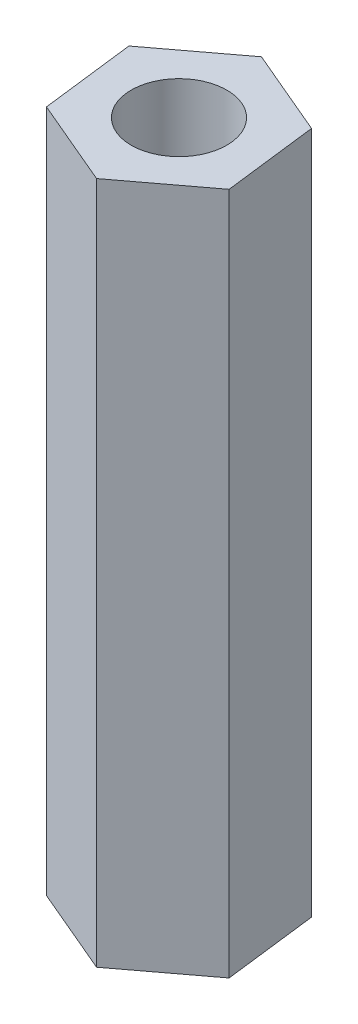
ISO-10303-21;
HEADER;
FILE_DESCRIPTION(('STEP AP214'),'2;1');
FILE_NAME('part.step','',(''),(''),'','','');
FILE_SCHEMA(('AUTOMOTIVE_DESIGN { 1 0 10303 214 1 1 1 1 }'));
ENDSEC;
DATA;
#1=APPLICATION_CONTEXT('core data for automotive mechanical design processes');
#2=APPLICATION_PROTOCOL_DEFINITION('international standard','automotive_design',2000,#1);
#3=PRODUCT_CONTEXT('',#1,'mechanical');
#4=PRODUCT('Part','Part','',(#3));
#5=PRODUCT_RELATED_PRODUCT_CATEGORY('part','',(#4));
#6=PRODUCT_DEFINITION_FORMATION('','',#4);
#7=PRODUCT_DEFINITION_CONTEXT('part definition',#1,'design');
#8=PRODUCT_DEFINITION('design','',#6,#7);
#9=PRODUCT_DEFINITION_SHAPE('','',#8);
#10=(LENGTH_UNIT() NAMED_UNIT(*) SI_UNIT(.MILLI.,.METRE.));
#11=(NAMED_UNIT(*) PLANE_ANGLE_UNIT() SI_UNIT($,.RADIAN.));
#12=(NAMED_UNIT(*) SI_UNIT($,.STERADIAN.) SOLID_ANGLE_UNIT());
#13=UNCERTAINTY_MEASURE_WITH_UNIT(LENGTH_MEASURE(1.E-05),#10,'distance_accuracy_value','');
#14=(GEOMETRIC_REPRESENTATION_CONTEXT(3) GLOBAL_UNCERTAINTY_ASSIGNED_CONTEXT((#13)) GLOBAL_UNIT_ASSIGNED_CONTEXT((#10,
#11,#12)) REPRESENTATION_CONTEXT('',''));
#15=CARTESIAN_POINT('',(0.,0.,0.));
#16=DIRECTION('',(0.,0.,1.));
#17=DIRECTION('',(1.,0.,0.));
#18=AXIS2_PLACEMENT_3D('',#15,#16,#17);
#19=CARTESIAN_POINT('',(0.,30.,0.));
#20=DIRECTION('',(0.,1.,0.));
#21=DIRECTION('',(0.,0.,1.));
#22=AXIS2_PLACEMENT_3D('',#19,#20,#21);
#23=PLANE('',#22);
#24=DIRECTION('',(-0.121573231281393,0.,-0.992582464803706));
#25=VECTOR('',#24,1.);
#26=CARTESIAN_POINT('',(3.82598208939698,30.,1.62538027907734));
#27=LINE('',#26,#25);
#28=CARTESIAN_POINT('',(3.82598208939698,30.,1.62538027907734));
#29=VERTEX_POINT('',#28);
#30=CARTESIAN_POINT('',(3.32061165718971,30.,-2.50070754430338));
#31=VERTEX_POINT('',#30);
#32=EDGE_CURVE('E131',#29,#31,#27,.T.);
#33=ORIENTED_EDGE('',*,*,#32,.T.);
#34=DIRECTION('',(-0.92038824551168,0.,-0.391005725692006));
#35=VECTOR('',#34,1.);
#36=CARTESIAN_POINT('',(3.32061165718971,30.,-2.50070754430338));
#37=LINE('',#36,#35);
#38=CARTESIAN_POINT('',(-0.505370432207269,30.,-4.12608782338072));
#39=VERTEX_POINT('',#38);
#40=EDGE_CURVE('E89',#31,#39,#37,.T.);
#41=ORIENTED_EDGE('',*,*,#40,.T.);
#42=DIRECTION('',(-0.798815014230286,0.,0.601576739111701));
#43=VECTOR('',#42,1.);
#44=CARTESIAN_POINT('',(-0.505370432207269,30.,-4.12608782338072));
#45=LINE('',#44,#43);
#46=CARTESIAN_POINT('',(-3.82598208939698,30.,-1.62538027907734));
#47=VERTEX_POINT('',#46);
#48=EDGE_CURVE('E102',#39,#47,#45,.T.);
#49=ORIENTED_EDGE('',*,*,#48,.T.);
#50=DIRECTION('',(0.121573231281393,0.,0.992582464803706));
#51=VECTOR('',#50,1.);
#52=CARTESIAN_POINT('',(-3.82598208939698,30.,-1.62538027907734));
#53=LINE('',#52,#51);
#54=CARTESIAN_POINT('',(-3.32061165718971,30.,2.50070754430338));
#55=VERTEX_POINT('',#54);
#56=EDGE_CURVE('E96',#47,#55,#53,.T.);
#57=ORIENTED_EDGE('',*,*,#56,.T.);
#58=DIRECTION('',(0.92038824551168,0.,0.391005725692006));
#59=VECTOR('',#58,1.);
#60=CARTESIAN_POINT('',(-3.32061165718971,30.,2.50070754430338));
#61=LINE('',#60,#59);
#62=CARTESIAN_POINT('',(0.50537043220727,30.,4.12608782338072));
#63=VERTEX_POINT('',#62);
#64=EDGE_CURVE('E100',#55,#63,#61,.T.);
#65=ORIENTED_EDGE('',*,*,#64,.T.);
#66=DIRECTION('',(0.798815014230286,0.,-0.601576739111701));
#67=VECTOR('',#66,1.);
#68=CARTESIAN_POINT('',(0.50537043220727,30.,4.12608782338072));
#69=LINE('',#68,#67);
#70=EDGE_CURVE('E52',#63,#29,#69,.T.);
#71=ORIENTED_EDGE('',*,*,#70,.T.);
#72=EDGE_LOOP('',(#33,#41,#49,#57,#65,#71));
#73=FACE_BOUND('',#72,.T.);
#74=CARTESIAN_POINT('',(0.,30.,0.));
#75=DIRECTION('',(0.,1.,0.));
#76=DIRECTION('',(0.,0.,1.));
#77=AXIS2_PLACEMENT_3D('',#74,#75,#76);
#78=CIRCLE('',#77,2.1);
#79=CARTESIAN_POINT('',(0.,30.,2.1));
#80=VERTEX_POINT('',#79);
#81=EDGE_CURVE('E124',#80,#80,#78,.T.);
#82=ORIENTED_EDGE('',*,*,#81,.F.);
#83=EDGE_LOOP('',(#82));
#84=FACE_BOUND('',#83,.T.);
#85=ADVANCED_FACE('F35',(#73,#84),#23,.T.);
#86=CARTESIAN_POINT('',(0.,0.,0.));
#87=DIRECTION('',(0.,1.,0.));
#88=DIRECTION('',(0.,0.,1.));
#89=AXIS2_PLACEMENT_3D('',#86,#87,#88);
#90=PLANE('',#89);
#91=DIRECTION('',(-0.121573231281393,0.,-0.992582464803706));
#92=VECTOR('',#91,1.);
#93=CARTESIAN_POINT('',(3.82598208939698,0.,1.62538027907734));
#94=LINE('',#93,#92);
#95=CARTESIAN_POINT('',(3.82598208939698,0.,1.62538027907734));
#96=VERTEX_POINT('',#95);
#97=CARTESIAN_POINT('',(3.32061165718971,0.,-2.50070754430338));
#98=VERTEX_POINT('',#97);
#99=EDGE_CURVE('E120',#96,#98,#94,.T.);
#100=ORIENTED_EDGE('',*,*,#99,.F.);
#101=DIRECTION('',(0.798815014230286,0.,-0.601576739111701));
#102=VECTOR('',#101,1.);
#103=CARTESIAN_POINT('',(0.50537043220727,0.,4.12608782338072));
#104=LINE('',#103,#102);
#105=CARTESIAN_POINT('',(0.50537043220727,0.,4.12608782338072));
#106=VERTEX_POINT('',#105);
#107=EDGE_CURVE('E81',#106,#96,#104,.T.);
#108=ORIENTED_EDGE('',*,*,#107,.F.);
#109=DIRECTION('',(0.92038824551168,0.,0.391005725692006));
#110=VECTOR('',#109,1.);
#111=CARTESIAN_POINT('',(-3.32061165718971,0.,2.50070754430338));
#112=LINE('',#111,#110);
#113=CARTESIAN_POINT('',(-3.32061165718971,0.,2.50070754430338));
#114=VERTEX_POINT('',#113);
#115=EDGE_CURVE('E75',#114,#106,#112,.T.);
#116=ORIENTED_EDGE('',*,*,#115,.F.);
#117=DIRECTION('',(0.121573231281393,0.,0.992582464803706));
#118=VECTOR('',#117,1.);
#119=CARTESIAN_POINT('',(-3.82598208939698,0.,-1.62538027907734));
#120=LINE('',#119,#118);
#121=CARTESIAN_POINT('',(-3.82598208939698,0.,-1.62538027907734));
#122=VERTEX_POINT('',#121);
#123=EDGE_CURVE('E110',#122,#114,#120,.T.);
#124=ORIENTED_EDGE('',*,*,#123,.F.);
#125=DIRECTION('',(-0.798815014230286,0.,0.601576739111701));
#126=VECTOR('',#125,1.);
#127=CARTESIAN_POINT('',(-0.505370432207269,0.,-4.12608782338072));
#128=LINE('',#127,#126);
#129=CARTESIAN_POINT('',(-0.505370432207269,0.,-4.12608782338072));
#130=VERTEX_POINT('',#129);
#131=EDGE_CURVE('E126',#130,#122,#128,.T.);
#132=ORIENTED_EDGE('',*,*,#131,.F.);
#133=DIRECTION('',(-0.92038824551168,0.,-0.391005725692006));
#134=VECTOR('',#133,1.);
#135=CARTESIAN_POINT('',(3.32061165718971,0.,-2.50070754430338));
#136=LINE('',#135,#134);
#137=EDGE_CURVE('E123',#98,#130,#136,.T.);
#138=ORIENTED_EDGE('',*,*,#137,.F.);
#139=EDGE_LOOP('',(#100,#108,#116,#124,#132,#138));
#140=FACE_BOUND('',#139,.T.);
#141=CARTESIAN_POINT('',(0.,0.,0.));
#142=DIRECTION('',(0.,1.,0.));
#143=DIRECTION('',(0.,0.,1.));
#144=AXIS2_PLACEMENT_3D('',#141,#142,#143);
#145=CIRCLE('',#144,2.1);
#146=CARTESIAN_POINT('',(0.,0.,2.1));
#147=VERTEX_POINT('',#146);
#148=EDGE_CURVE('E224',#147,#147,#145,.T.);
#149=ORIENTED_EDGE('',*,*,#148,.T.);
#150=EDGE_LOOP('',(#149));
#151=FACE_BOUND('',#150,.T.);
#152=ADVANCED_FACE('F140',(#140,#151),#90,.F.);
#153=CARTESIAN_POINT('',(3.82598208939698,30.,1.62538027907734));
#154=DIRECTION('',(-0.992582464803706,0.,0.121573231281393));
#155=DIRECTION('',(0.121573231281393,0.,0.992582464803706));
#156=AXIS2_PLACEMENT_3D('',#153,#154,#155);
#157=PLANE('',#156);
#158=ORIENTED_EDGE('',*,*,#99,.T.);
#159=DIRECTION('',(0.,-1.,0.));
#160=VECTOR('',#159,1.);
#161=CARTESIAN_POINT('',(3.32061165718971,30.,-2.50070754430338));
#162=LINE('',#161,#160);
#163=EDGE_CURVE('E11',#31,#98,#162,.T.);
#164=ORIENTED_EDGE('',*,*,#163,.F.);
#165=ORIENTED_EDGE('',*,*,#32,.F.);
#166=DIRECTION('',(0.,-1.,0.));
#167=VECTOR('',#166,1.);
#168=CARTESIAN_POINT('',(3.82598208939698,30.,1.62538027907734));
#169=LINE('',#168,#167);
#170=EDGE_CURVE('E116',#29,#96,#169,.T.);
#171=ORIENTED_EDGE('',*,*,#170,.T.);
#172=EDGE_LOOP('',(#158,#164,#165,#171));
#173=FACE_BOUND('',#172,.T.);
#174=ADVANCED_FACE('F37',(#173),#157,.F.);
#175=CARTESIAN_POINT('',(3.32061165718971,30.,-2.50070754430338));
#176=DIRECTION('',(-0.391005725692006,0.,0.92038824551168));
#177=DIRECTION('',(0.92038824551168,0.,0.391005725692006));
#178=AXIS2_PLACEMENT_3D('',#175,#176,#177);
#179=PLANE('',#178);
#180=ORIENTED_EDGE('',*,*,#137,.T.);
#181=DIRECTION('',(0.,-1.,0.));
#182=VECTOR('',#181,1.);
#183=CARTESIAN_POINT('',(-0.505370432207269,30.,-4.12608782338072));
#184=LINE('',#183,#182);
#185=EDGE_CURVE('E44',#39,#130,#184,.T.);
#186=ORIENTED_EDGE('',*,*,#185,.F.);
#187=ORIENTED_EDGE('',*,*,#40,.F.);
#188=ORIENTED_EDGE('',*,*,#163,.T.);
#189=EDGE_LOOP('',(#180,#186,#187,#188));
#190=FACE_BOUND('',#189,.T.);
#191=ADVANCED_FACE('F165',(#190),#179,.F.);
#192=CARTESIAN_POINT('',(-0.505370432207269,30.,-4.12608782338072));
#193=DIRECTION('',(0.601576739111701,0.,0.798815014230286));
#194=DIRECTION('',(0.798815014230286,0.,-0.601576739111701));
#195=AXIS2_PLACEMENT_3D('',#192,#193,#194);
#196=PLANE('',#195);
#197=ORIENTED_EDGE('',*,*,#131,.T.);
#198=DIRECTION('',(0.,-1.,0.));
#199=VECTOR('',#198,1.);
#200=CARTESIAN_POINT('',(-3.82598208939698,30.,-1.62538027907734));
#201=LINE('',#200,#199);
#202=EDGE_CURVE('E111',#47,#122,#201,.T.);
#203=ORIENTED_EDGE('',*,*,#202,.F.);
#204=ORIENTED_EDGE('',*,*,#48,.F.);
#205=ORIENTED_EDGE('',*,*,#185,.T.);
#206=EDGE_LOOP('',(#197,#203,#204,#205));
#207=FACE_BOUND('',#206,.T.);
#208=ADVANCED_FACE('F137',(#207),#196,.F.);
#209=CARTESIAN_POINT('',(-3.82598208939698,30.,-1.62538027907734));
#210=DIRECTION('',(0.992582464803706,0.,-0.121573231281393));
#211=DIRECTION('',(-0.121573231281393,0.,-0.992582464803706));
#212=AXIS2_PLACEMENT_3D('',#209,#210,#211);
#213=PLANE('',#212);
#214=ORIENTED_EDGE('',*,*,#123,.T.);
#215=DIRECTION('',(0.,-1.,0.));
#216=VECTOR('',#215,1.);
#217=CARTESIAN_POINT('',(-3.32061165718971,30.,2.50070754430338));
#218=LINE('',#217,#216);
#219=EDGE_CURVE('E107',#55,#114,#218,.T.);
#220=ORIENTED_EDGE('',*,*,#219,.F.);
#221=ORIENTED_EDGE('',*,*,#56,.F.);
#222=ORIENTED_EDGE('',*,*,#202,.T.);
#223=EDGE_LOOP('',(#214,#220,#221,#222));
#224=FACE_BOUND('',#223,.T.);
#225=ADVANCED_FACE('F108',(#224),#213,.F.);
#226=CARTESIAN_POINT('',(-3.32061165718971,30.,2.50070754430338));
#227=DIRECTION('',(0.391005725692006,0.,-0.92038824551168));
#228=DIRECTION('',(-0.92038824551168,0.,-0.391005725692006));
#229=AXIS2_PLACEMENT_3D('',#226,#227,#228);
#230=PLANE('',#229);
#231=ORIENTED_EDGE('',*,*,#115,.T.);
#232=DIRECTION('',(0.,-1.,0.));
#233=VECTOR('',#232,1.);
#234=CARTESIAN_POINT('',(0.50537043220727,30.,4.12608782338072));
#235=LINE('',#234,#233);
#236=EDGE_CURVE('E112',#63,#106,#235,.T.);
#237=ORIENTED_EDGE('',*,*,#236,.F.);
#238=ORIENTED_EDGE('',*,*,#64,.F.);
#239=ORIENTED_EDGE('',*,*,#219,.T.);
#240=EDGE_LOOP('',(#231,#237,#238,#239));
#241=FACE_BOUND('',#240,.T.);
#242=ADVANCED_FACE('F114',(#241),#230,.F.);
#243=CARTESIAN_POINT('',(0.50537043220727,30.,4.12608782338072));
#244=DIRECTION('',(-0.601576739111701,0.,-0.798815014230286));
#245=DIRECTION('',(-0.798815014230286,0.,0.601576739111701));
#246=AXIS2_PLACEMENT_3D('',#243,#244,#245);
#247=PLANE('',#246);
#248=ORIENTED_EDGE('',*,*,#107,.T.);
#249=ORIENTED_EDGE('',*,*,#170,.F.);
#250=ORIENTED_EDGE('',*,*,#70,.F.);
#251=ORIENTED_EDGE('',*,*,#236,.T.);
#252=EDGE_LOOP('',(#248,#249,#250,#251));
#253=FACE_BOUND('',#252,.T.);
#254=ADVANCED_FACE('F145',(#253),#247,.F.);
#255=CARTESIAN_POINT('',(0.,30.,0.));
#256=DIRECTION('',(0.,-1.,0.));
#257=DIRECTION('',(0.,0.,-1.));
#258=AXIS2_PLACEMENT_3D('',#255,#256,#257);
#259=CYLINDRICAL_SURFACE('',#258,2.1);
#260=ORIENTED_EDGE('',*,*,#81,.T.);
#261=EDGE_LOOP('',(#260));
#262=FACE_BOUND('',#261,.T.);
#263=ORIENTED_EDGE('',*,*,#148,.F.);
#264=EDGE_LOOP('',(#263));
#265=FACE_BOUND('',#264,.T.);
#266=ADVANCED_FACE('F147',(#262,#265),#259,.F.);
#267=CLOSED_SHELL('',(#85,#152,#174,#191,#208,#225,#242,#254,#266));
#268=MANIFOLD_SOLID_BREP('B2',#267);
#269=ADVANCED_BREP_SHAPE_REPRESENTATION('',(#18,#268),#14);
#270=SHAPE_DEFINITION_REPRESENTATION(#9,#269);
ENDSEC;
END-ISO-10303-21;
